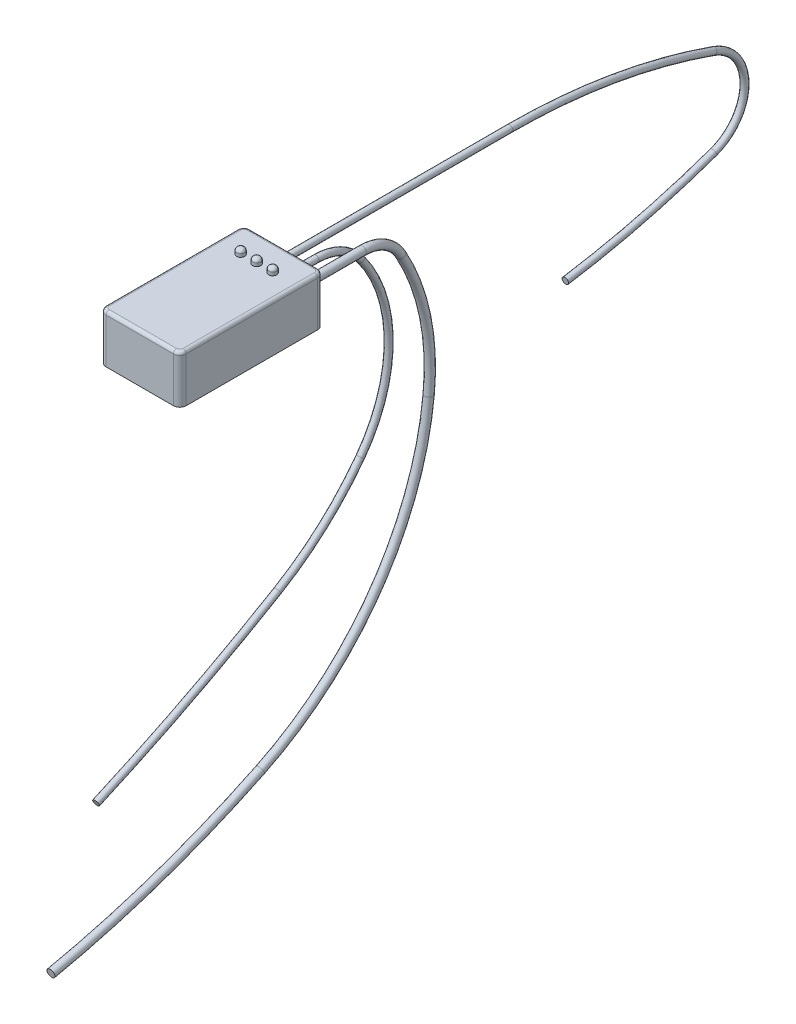
ISO-10303-21;
HEADER;
FILE_DESCRIPTION(('STEP AP214'),'2;1');
FILE_NAME('part.step','',(''),(''),'','','');
FILE_SCHEMA(('AUTOMOTIVE_DESIGN { 1 0 10303 214 1 1 1 1 }'));
ENDSEC;
DATA;
#1=APPLICATION_CONTEXT('core data for automotive mechanical design processes');
#2=APPLICATION_PROTOCOL_DEFINITION('international standard','automotive_design',2000,#1);
#3=PRODUCT_CONTEXT('',#1,'mechanical');
#4=PRODUCT('Part','Part','',(#3));
#5=PRODUCT_RELATED_PRODUCT_CATEGORY('part','',(#4));
#6=PRODUCT_DEFINITION_FORMATION('','',#4);
#7=PRODUCT_DEFINITION_CONTEXT('part definition',#1,'design');
#8=PRODUCT_DEFINITION('design','',#6,#7);
#9=PRODUCT_DEFINITION_SHAPE('','',#8);
#10=(LENGTH_UNIT() NAMED_UNIT(*) SI_UNIT(.MILLI.,.METRE.));
#11=(NAMED_UNIT(*) PLANE_ANGLE_UNIT() SI_UNIT($,.RADIAN.));
#12=(NAMED_UNIT(*) SI_UNIT($,.STERADIAN.) SOLID_ANGLE_UNIT());
#13=UNCERTAINTY_MEASURE_WITH_UNIT(LENGTH_MEASURE(1.E-05),#10,'distance_accuracy_value','');
#14=(GEOMETRIC_REPRESENTATION_CONTEXT(3) GLOBAL_UNCERTAINTY_ASSIGNED_CONTEXT((#13)) GLOBAL_UNIT_ASSIGNED_CONTEXT((#10,
#11,#12)) REPRESENTATION_CONTEXT('',''));
#15=CARTESIAN_POINT('',(0.,0.,0.));
#16=DIRECTION('',(0.,0.,1.));
#17=DIRECTION('',(1.,0.,0.));
#18=AXIS2_PLACEMENT_3D('',#15,#16,#17);
#19=CARTESIAN_POINT('',(10.,277.10516450602,228.03735027729));
#20=DIRECTION('',(-1.,0.,0.));
#21=DIRECTION('',(0.,0.,1.));
#22=AXIS2_PLACEMENT_3D('',#19,#20,#21);
#23=TOROIDAL_SURFACE('',#22,569.119683702392,2.5);
#24=CARTESIAN_POINT('',(10.,-234.987444743006,-20.2736924293021));
#25=DIRECTION('',(0.,-0.436307247521666,0.899797747141027));
#26=DIRECTION('',(-1.,0.,0.));
#27=AXIS2_PLACEMENT_3D('',#24,#25,#26);
#28=CIRCLE('',#27,2.5);
#29=CARTESIAN_POINT('',(10.,-237.236939110858,-21.3644605481063));
#30=VERTEX_POINT('',#29);
#31=EDGE_CURVE('E50',#30,#30,#28,.T.);
#32=CARTESIAN_POINT('',(10.,-279.727978420525,110.419046786479));
#33=DIRECTION('',(0.,-0.206667080508705,0.97841132343918));
#34=DIRECTION('',(-1.,0.,0.));
#35=AXIS2_PLACEMENT_3D('',#32,#33,#34);
#36=CIRCLE('',#35,2.5);
#37=CARTESIAN_POINT('',(10.,-282.174006729123,109.902379085207));
#38=VERTEX_POINT('',#37);
#39=EDGE_CURVE('E11',#38,#38,#36,.T.);
#40=CARTESIAN_POINT('',(10.,277.10516450602,228.03735027729));
#41=DIRECTION('',(-1.,0.,0.));
#42=DIRECTION('',(0.,0.,1.));
#43=AXIS2_PLACEMENT_3D('',#40,#41,#42);
#44=CIRCLE('',#43,571.619683702392);
#45=EDGE_CURVE('',#30,#38,#44,.T.);
#46=ORIENTED_EDGE('',*,*,#31,.T.);
#47=ORIENTED_EDGE('',*,*,#39,.F.);
#48=ORIENTED_EDGE('',*,*,#45,.T.);
#49=ORIENTED_EDGE('',*,*,#45,.F.);
#50=EDGE_LOOP('',(#46,#48,#47,#49));
#51=FACE_BOUND('',#50,.T.);
#52=ADVANCED_FACE('F44',(#51),#23,.T.);
#53=CARTESIAN_POINT('',(10.,-65.6304696890282,61.8466239075371));
#54=DIRECTION('',(-1.,0.,0.));
#55=DIRECTION('',(0.,0.,1.));
#56=AXIS2_PLACEMENT_3D('',#53,#54,#55);
#57=TOROIDAL_SURFACE('',#56,188.216713802723,2.5);
#58=CARTESIAN_POINT('',(10.,-84.5104083685493,-125.4207765394));
#59=DIRECTION('',(0.,-0.994956274941765,0.100309575584822));
#60=DIRECTION('',(-1.,0.,0.));
#61=AXIS2_PLACEMENT_3D('',#58,#59,#60);
#62=CIRCLE('',#61,2.5);
#63=CARTESIAN_POINT('',(10.,-84.7611823075114,-127.908167226755));
#64=VERTEX_POINT('',#63);
#65=EDGE_CURVE('E54',#64,#64,#62,.T.);
#66=CARTESIAN_POINT('',(10.,-65.6304696890282,61.8466239075371));
#67=DIRECTION('',(-1.,0.,0.));
#68=DIRECTION('',(0.,0.,1.));
#69=AXIS2_PLACEMENT_3D('',#66,#67,#68);
#70=CIRCLE('',#69,190.716713802723);
#71=EDGE_CURVE('',#64,#30,#70,.T.);
#72=ORIENTED_EDGE('',*,*,#65,.T.);
#73=ORIENTED_EDGE('',*,*,#31,.F.);
#74=ORIENTED_EDGE('',*,*,#71,.T.);
#75=ORIENTED_EDGE('',*,*,#71,.F.);
#76=EDGE_LOOP('',(#72,#74,#73,#75));
#77=FACE_BOUND('',#76,.T.);
#78=ADVANCED_FACE('F88',(#77),#57,.T.);
#79=CARTESIAN_POINT('',(10.,-70.1123783380911,17.3912156566061));
#80=DIRECTION('',(-1.,0.,0.));
#81=DIRECTION('',(0.,0.,1.));
#82=AXIS2_PLACEMENT_3D('',#79,#80,#81);
#83=TOROIDAL_SURFACE('',#82,143.535948053964,2.5);
#84=CARTESIAN_POINT('',(10.,0.,-107.855831364578));
#85=DIRECTION('',(0.,-0.872583131398524,-0.488465637275281));
#86=DIRECTION('',(-1.,0.,0.));
#87=AXIS2_PLACEMENT_3D('',#84,#85,#86);
#88=CIRCLE('',#87,2.5);
#89=CARTESIAN_POINT('',(10.,1.22116409318819,-110.037289193074));
#90=VERTEX_POINT('',#89);
#91=EDGE_CURVE('E58',#90,#90,#88,.T.);
#92=CARTESIAN_POINT('',(10.,-70.1123783380911,17.3912156566061));
#93=DIRECTION('',(-1.,0.,0.));
#94=DIRECTION('',(0.,0.,1.));
#95=AXIS2_PLACEMENT_3D('',#92,#93,#94);
#96=CIRCLE('',#95,146.035948053964);
#97=EDGE_CURVE('',#90,#64,#96,.T.);
#98=ORIENTED_EDGE('',*,*,#91,.T.);
#99=ORIENTED_EDGE('',*,*,#65,.F.);
#100=ORIENTED_EDGE('',*,*,#97,.T.);
#101=ORIENTED_EDGE('',*,*,#97,.F.);
#102=EDGE_LOOP('',(#98,#100,#99,#101));
#103=FACE_BOUND('',#102,.T.);
#104=ADVANCED_FACE('F92',(#103),#83,.T.);
#105=CARTESIAN_POINT('',(10.,-13.368640349845,-83.9744174659898));
#106=DIRECTION('',(-1.,0.,0.));
#107=DIRECTION('',(0.,0.,1.));
#108=AXIS2_PLACEMENT_3D('',#105,#106,#107);
#109=TOROIDAL_SURFACE('',#108,27.368640349845,2.5);
#110=CARTESIAN_POINT('',(10.,14.,-83.9744174659898));
#111=DIRECTION('',(0.,0.,-1.));
#112=DIRECTION('',(-1.,0.,0.));
#113=AXIS2_PLACEMENT_3D('',#110,#111,#112);
#114=CIRCLE('',#113,2.5);
#115=CARTESIAN_POINT('',(10.,16.5,-83.9744174659898));
#116=VERTEX_POINT('',#115);
#117=EDGE_CURVE('E63',#116,#116,#114,.T.);
#118=CARTESIAN_POINT('',(10.,-13.368640349845,-83.9744174659898));
#119=DIRECTION('',(-1.,0.,0.));
#120=DIRECTION('',(0.,0.,1.));
#121=AXIS2_PLACEMENT_3D('',#118,#119,#120);
#122=CIRCLE('',#121,29.868640349845);
#123=EDGE_CURVE('',#116,#90,#122,.T.);
#124=ORIENTED_EDGE('',*,*,#117,.T.);
#125=ORIENTED_EDGE('',*,*,#91,.F.);
#126=ORIENTED_EDGE('',*,*,#123,.T.);
#127=ORIENTED_EDGE('',*,*,#123,.F.);
#128=EDGE_LOOP('',(#124,#126,#125,#127));
#129=FACE_BOUND('',#128,.T.);
#130=ADVANCED_FACE('F70',(#129),#109,.T.);
#131=CARTESIAN_POINT('',(10.,14.,-83.9744174659898));
#132=DIRECTION('',(0.,0.,1.));
#133=DIRECTION('',(0.,-1.,0.));
#134=AXIS2_PLACEMENT_3D('',#131,#132,#133);
#135=CYLINDRICAL_SURFACE('',#134,2.5);
#136=ORIENTED_EDGE('',*,*,#117,.F.);
#137=EDGE_LOOP('',(#136));
#138=FACE_BOUND('',#137,.T.);
#139=CARTESIAN_POINT('',(10.,14.,-41.));
#140=DIRECTION('',(0.,0.,-1.));
#141=DIRECTION('',(-1.,0.,0.));
#142=AXIS2_PLACEMENT_3D('',#139,#140,#141);
#143=CIRCLE('',#142,2.5);
#144=CARTESIAN_POINT('',(7.5,14.,-41.));
#145=VERTEX_POINT('',#144);
#146=EDGE_CURVE('E64',#145,#145,#143,.T.);
#147=ORIENTED_EDGE('',*,*,#146,.T.);
#148=EDGE_LOOP('',(#147));
#149=FACE_BOUND('',#148,.T.);
#150=ADVANCED_FACE('F73',(#138,#149),#135,.T.);
#151=CARTESIAN_POINT('',(10.,-279.727978420525,110.419046786479));
#152=DIRECTION('',(0.,-0.206667080508705,0.97841132343918));
#153=DIRECTION('',(-1.,0.,0.));
#154=AXIS2_PLACEMENT_3D('',#151,#152,#153);
#155=PLANE('',#154);
#156=ORIENTED_EDGE('',*,*,#39,.T.);
#157=EDGE_LOOP('',(#156));
#158=FACE_BOUND('',#157,.T.);
#159=ADVANCED_FACE('F76',(#158),#155,.T.);
#160=CARTESIAN_POINT('',(10.,14.,-41.));
#161=DIRECTION('',(0.,0.,-1.));
#162=DIRECTION('',(-1.,0.,0.));
#163=AXIS2_PLACEMENT_3D('',#160,#161,#162);
#164=PLANE('',#163);
#165=ORIENTED_EDGE('',*,*,#146,.F.);
#166=EDGE_LOOP('',(#165));
#167=FACE_BOUND('',#166,.T.);
#168=ADVANCED_FACE('F80',(#167),#164,.F.);
#169=CLOSED_SHELL('',(#52,#78,#104,#130,#150,#159,#168));
#170=MANIFOLD_SOLID_BREP('B2',#169);
#171=CARTESIAN_POINT('',(0.,746.95104154458,492.305029356148));
#172=DIRECTION('',(-1.,0.,0.));
#173=DIRECTION('',(0.,0.,1.));
#174=AXIS2_PLACEMENT_3D('',#171,#172,#173);
#175=TOROIDAL_SURFACE('',#174,1046.59381629685,2.);
#176=CARTESIAN_POINT('',(0.,-153.573451167439,-41.0000000000001));
#177=DIRECTION('',(0.,-0.509562564819212,0.860433607278834));
#178=DIRECTION('',(-1.,0.,0.));
#179=AXIS2_PLACEMENT_3D('',#176,#177,#178);
#180=CIRCLE('',#179,2.);
#181=CARTESIAN_POINT('',(0.,-155.294318381997,-42.0191251296385));
#182=VERTEX_POINT('',#181);
#183=EDGE_CURVE('E159',#182,#182,#180,.T.);
#184=CARTESIAN_POINT('',(0.,-211.656753955002,72.2696609426853));
#185=DIRECTION('',(0.,-0.401335610695342,0.915931071417384));
#186=DIRECTION('',(-1.,0.,0.));
#187=AXIS2_PLACEMENT_3D('',#184,#185,#186);
#188=CIRCLE('',#187,2.);
#189=CARTESIAN_POINT('',(0.,-213.488616097837,71.4669897212945));
#190=VERTEX_POINT('',#189);
#191=EDGE_CURVE('E43',#190,#190,#188,.T.);
#192=CARTESIAN_POINT('',(0.,746.95104154458,492.305029356148));
#193=DIRECTION('',(-1.,0.,0.));
#194=DIRECTION('',(0.,0.,1.));
#195=AXIS2_PLACEMENT_3D('',#192,#193,#194);
#196=CIRCLE('',#195,1048.59381629685);
#197=EDGE_CURVE('',#182,#190,#196,.T.);
#198=ORIENTED_EDGE('',*,*,#183,.T.);
#199=ORIENTED_EDGE('',*,*,#191,.F.);
#200=ORIENTED_EDGE('',*,*,#197,.T.);
#201=ORIENTED_EDGE('',*,*,#197,.F.);
#202=EDGE_LOOP('',(#198,#200,#199,#201));
#203=FACE_BOUND('',#202,.T.);
#204=ADVANCED_FACE('F153',(#203),#175,.T.);
#205=CARTESIAN_POINT('',(0.,-1.7794884782628,48.8948161690093));
#206=DIRECTION('',(-1.,0.,0.));
#207=DIRECTION('',(0.,0.,1.));
#208=AXIS2_PLACEMENT_3D('',#205,#206,#207);
#209=TOROIDAL_SURFACE('',#208,176.415659970829,2.);
#210=CARTESIAN_POINT('',(0.,-106.900434751906,-92.7811229931397));
#211=DIRECTION('',(0.,-0.803080288822296,0.595870833071311));
#212=DIRECTION('',(-1.,0.,0.));
#213=AXIS2_PLACEMENT_3D('',#210,#211,#212);
#214=CIRCLE('',#213,2.);
#215=CARTESIAN_POINT('',(0.,-108.092176418048,-94.3872835707843));
#216=VERTEX_POINT('',#215);
#217=EDGE_CURVE('E163',#216,#216,#214,.T.);
#218=CARTESIAN_POINT('',(0.,-1.7794884782628,48.8948161690093));
#219=DIRECTION('',(-1.,0.,0.));
#220=DIRECTION('',(0.,0.,1.));
#221=AXIS2_PLACEMENT_3D('',#218,#219,#220);
#222=CIRCLE('',#221,178.415659970829);
#223=EDGE_CURVE('',#216,#182,#222,.T.);
#224=ORIENTED_EDGE('',*,*,#217,.T.);
#225=ORIENTED_EDGE('',*,*,#183,.F.);
#226=ORIENTED_EDGE('',*,*,#223,.T.);
#227=ORIENTED_EDGE('',*,*,#223,.F.);
#228=EDGE_LOOP('',(#224,#226,#225,#227));
#229=FACE_BOUND('',#228,.T.);
#230=ADVANCED_FACE('F197',(#229),#209,.T.);
#231=CARTESIAN_POINT('',(0.,-53.4502173759529,-20.744007521912));
#232=DIRECTION('',(-1.,0.,0.));
#233=DIRECTION('',(0.,0.,1.));
#234=AXIS2_PLACEMENT_3D('',#231,#232,#233);
#235=TOROIDAL_SURFACE('',#234,89.7010130542103,2.);
#236=CARTESIAN_POINT('',(0.,0.,-92.7811229931397));
#237=DIRECTION('',(0.,-0.803080288822295,-0.595870833071312));
#238=DIRECTION('',(-1.,0.,0.));
#239=AXIS2_PLACEMENT_3D('',#236,#237,#238);
#240=CIRCLE('',#239,2.);
#241=CARTESIAN_POINT('',(0.,1.19174166614262,-94.3872835707843));
#242=VERTEX_POINT('',#241);
#243=EDGE_CURVE('E167',#242,#242,#240,.T.);
#244=CARTESIAN_POINT('',(0.,-53.4502173759529,-20.744007521912));
#245=DIRECTION('',(-1.,0.,0.));
#246=DIRECTION('',(0.,0.,1.));
#247=AXIS2_PLACEMENT_3D('',#244,#245,#246);
#248=CIRCLE('',#247,91.7010130542103);
#249=EDGE_CURVE('',#242,#216,#248,.T.);
#250=ORIENTED_EDGE('',*,*,#243,.T.);
#251=ORIENTED_EDGE('',*,*,#217,.F.);
#252=ORIENTED_EDGE('',*,*,#249,.T.);
#253=ORIENTED_EDGE('',*,*,#249,.F.);
#254=EDGE_LOOP('',(#250,#252,#251,#253));
#255=FACE_BOUND('',#254,.T.);
#256=ADVANCED_FACE('F201',(#255),#235,.T.);
#257=CARTESIAN_POINT('',(0.,-20.6423894775959,-64.9605028459775));
#258=DIRECTION('',(-1.,0.,0.));
#259=DIRECTION('',(0.,0.,1.));
#260=AXIS2_PLACEMENT_3D('',#257,#258,#259);
#261=TOROIDAL_SURFACE('',#260,34.6423894775959,2.);
#262=CARTESIAN_POINT('',(0.,14.,-64.9605028459775));
#263=DIRECTION('',(0.,0.,-1.));
#264=DIRECTION('',(-1.,0.,0.));
#265=AXIS2_PLACEMENT_3D('',#262,#263,#264);
#266=CIRCLE('',#265,2.);
#267=CARTESIAN_POINT('',(0.,16.,-64.9605028459775));
#268=VERTEX_POINT('',#267);
#269=EDGE_CURVE('E172',#268,#268,#266,.T.);
#270=CARTESIAN_POINT('',(0.,-20.6423894775959,-64.9605028459775));
#271=DIRECTION('',(-1.,0.,0.));
#272=DIRECTION('',(0.,0.,1.));
#273=AXIS2_PLACEMENT_3D('',#270,#271,#272);
#274=CIRCLE('',#273,36.6423894775959);
#275=EDGE_CURVE('',#268,#242,#274,.T.);
#276=ORIENTED_EDGE('',*,*,#269,.T.);
#277=ORIENTED_EDGE('',*,*,#243,.F.);
#278=ORIENTED_EDGE('',*,*,#275,.T.);
#279=ORIENTED_EDGE('',*,*,#275,.F.);
#280=EDGE_LOOP('',(#276,#278,#277,#279));
#281=FACE_BOUND('',#280,.T.);
#282=ADVANCED_FACE('F179',(#281),#261,.T.);
#283=CARTESIAN_POINT('',(0.,14.,-64.9605028459775));
#284=DIRECTION('',(0.,0.,1.));
#285=DIRECTION('',(0.,-1.,0.));
#286=AXIS2_PLACEMENT_3D('',#283,#284,#285);
#287=CYLINDRICAL_SURFACE('',#286,2.);
#288=ORIENTED_EDGE('',*,*,#269,.F.);
#289=EDGE_LOOP('',(#288));
#290=FACE_BOUND('',#289,.T.);
#291=CARTESIAN_POINT('',(0.,14.,-41.));
#292=DIRECTION('',(0.,0.,-1.));
#293=DIRECTION('',(-1.,0.,0.));
#294=AXIS2_PLACEMENT_3D('',#291,#292,#293);
#295=CIRCLE('',#294,2.);
#296=CARTESIAN_POINT('',(-2.,14.,-41.));
#297=VERTEX_POINT('',#296);
#298=EDGE_CURVE('E173',#297,#297,#295,.T.);
#299=ORIENTED_EDGE('',*,*,#298,.T.);
#300=EDGE_LOOP('',(#299));
#301=FACE_BOUND('',#300,.T.);
#302=ADVANCED_FACE('F182',(#290,#301),#287,.T.);
#303=CARTESIAN_POINT('',(0.,-211.656753955002,72.2696609426853));
#304=DIRECTION('',(0.,-0.401335610695342,0.915931071417384));
#305=DIRECTION('',(-1.,0.,0.));
#306=AXIS2_PLACEMENT_3D('',#303,#304,#305);
#307=PLANE('',#306);
#308=ORIENTED_EDGE('',*,*,#191,.T.);
#309=EDGE_LOOP('',(#308));
#310=FACE_BOUND('',#309,.T.);
#311=ADVANCED_FACE('F185',(#310),#307,.T.);
#312=CARTESIAN_POINT('',(0.,14.,-41.));
#313=DIRECTION('',(0.,0.,-1.));
#314=DIRECTION('',(-1.,0.,0.));
#315=AXIS2_PLACEMENT_3D('',#312,#313,#314);
#316=PLANE('',#315);
#317=ORIENTED_EDGE('',*,*,#298,.F.);
#318=EDGE_LOOP('',(#317));
#319=FACE_BOUND('',#318,.T.);
#320=ADVANCED_FACE('F189',(#319),#316,.F.);
#321=CLOSED_SHELL('',(#204,#230,#256,#282,#302,#311,#320));
#322=MANIFOLD_SOLID_BREP('B6',#321);
#323=CARTESIAN_POINT('',(-10.,425.314344756156,-151.160472883657));
#324=DIRECTION('',(-1.,0.,0.));
#325=DIRECTION('',(0.,0.,1.));
#326=AXIS2_PLACEMENT_3D('',#323,#324,#325);
#327=TOROIDAL_SURFACE('',#326,517.294417473573,2.);
#328=CARTESIAN_POINT('',(-10.,-62.4995777723773,-323.297311871274));
#329=DIRECTION('',(0.,-0.3327637669632,0.943010220197247));
#330=DIRECTION('',(-1.,0.,0.));
#331=AXIS2_PLACEMENT_3D('',#328,#329,#330);
#332=CIRCLE('',#331,2.);
#333=CARTESIAN_POINT('',(-10.,-64.3855982127717,-323.962839405201));
#334=VERTEX_POINT('',#333);
#335=EDGE_CURVE('E270',#334,#334,#332,.T.);
#336=CARTESIAN_POINT('',(-10.,-85.8194212672105,-230.758133528259));
#337=DIRECTION('',(0.,-0.153873032369594,0.988090628388604));
#338=DIRECTION('',(-1.,0.,0.));
#339=AXIS2_PLACEMENT_3D('',#336,#337,#338);
#340=CIRCLE('',#339,2.);
#341=CARTESIAN_POINT('',(-10.,-87.7956025239876,-231.065879592999));
#342=VERTEX_POINT('',#341);
#343=EDGE_CURVE('E152',#342,#342,#340,.T.);
#344=CARTESIAN_POINT('',(-10.,425.314344756156,-151.160472883657));
#345=DIRECTION('',(-1.,0.,0.));
#346=DIRECTION('',(0.,0.,1.));
#347=AXIS2_PLACEMENT_3D('',#344,#345,#346);
#348=CIRCLE('',#347,519.294417473573);
#349=EDGE_CURVE('',#334,#342,#348,.T.);
#350=ORIENTED_EDGE('',*,*,#335,.T.);
#351=ORIENTED_EDGE('',*,*,#343,.F.);
#352=ORIENTED_EDGE('',*,*,#349,.T.);
#353=ORIENTED_EDGE('',*,*,#349,.F.);
#354=EDGE_LOOP('',(#350,#352,#351,#353));
#355=FACE_BOUND('',#354,.T.);
#356=ADVANCED_FACE('F264',(#355),#327,.T.);
#357=CARTESIAN_POINT('',(-10.,-35.1540219229831,-313.647776819312));
#358=DIRECTION('',(-1.,0.,0.));
#359=DIRECTION('',(0.,0.,1.));
#360=AXIS2_PLACEMENT_3D('',#357,#358,#359);
#361=TOROIDAL_SURFACE('',#360,28.9981542762877,2.);
#362=CARTESIAN_POINT('',(-10.,-7.80846607358896,-323.297311871274));
#363=DIRECTION('',(0.,-0.332763766963516,-0.943010220197136));
#364=DIRECTION('',(-1.,0.,0.));
#365=AXIS2_PLACEMENT_3D('',#362,#363,#364);
#366=CIRCLE('',#365,2.);
#367=CARTESIAN_POINT('',(-10.,-5.92244563319458,-323.962839405201));
#368=VERTEX_POINT('',#367);
#369=EDGE_CURVE('E274',#368,#368,#366,.T.);
#370=CARTESIAN_POINT('',(-10.,-35.1540219229831,-313.647776819312));
#371=DIRECTION('',(-1.,0.,0.));
#372=DIRECTION('',(0.,0.,1.));
#373=AXIS2_PLACEMENT_3D('',#370,#371,#372);
#374=CIRCLE('',#373,30.9981542762877);
#375=EDGE_CURVE('',#368,#334,#374,.T.);
#376=ORIENTED_EDGE('',*,*,#369,.T.);
#377=ORIENTED_EDGE('',*,*,#335,.F.);
#378=ORIENTED_EDGE('',*,*,#375,.T.);
#379=ORIENTED_EDGE('',*,*,#375,.F.);
#380=EDGE_LOOP('',(#376,#378,#377,#379));
#381=FACE_BOUND('',#380,.T.);
#382=ADVANCED_FACE('F305',(#381),#361,.T.);
#383=CARTESIAN_POINT('',(-10.,-368.673281929279,-195.957509060196));
#384=DIRECTION('',(-1.,0.,0.));
#385=DIRECTION('',(0.,0.,1.));
#386=AXIS2_PLACEMENT_3D('',#383,#384,#385);
#387=TOROIDAL_SURFACE('',#386,382.673281929279,2.);
#388=CARTESIAN_POINT('',(-10.,14.,-195.957509060196));
#389=DIRECTION('',(0.,0.,-1.));
#390=DIRECTION('',(-1.,0.,0.));
#391=AXIS2_PLACEMENT_3D('',#388,#389,#390);
#392=CIRCLE('',#391,2.);
#393=CARTESIAN_POINT('',(-10.,16.,-195.957509060196));
#394=VERTEX_POINT('',#393);
#395=EDGE_CURVE('E278',#394,#394,#392,.T.);
#396=CARTESIAN_POINT('',(-10.,-368.673281929279,-195.957509060196));
#397=DIRECTION('',(-1.,0.,0.));
#398=DIRECTION('',(0.,0.,1.));
#399=AXIS2_PLACEMENT_3D('',#396,#397,#398);
#400=CIRCLE('',#399,384.673281929279);
#401=EDGE_CURVE('',#394,#368,#400,.T.);
#402=ORIENTED_EDGE('',*,*,#395,.T.);
#403=ORIENTED_EDGE('',*,*,#369,.F.);
#404=ORIENTED_EDGE('',*,*,#401,.T.);
#405=ORIENTED_EDGE('',*,*,#401,.F.);
#406=EDGE_LOOP('',(#402,#404,#403,#405));
#407=FACE_BOUND('',#406,.T.);
#408=ADVANCED_FACE('F287',(#407),#387,.T.);
#409=CARTESIAN_POINT('',(-10.,14.,-195.957509060196));
#410=DIRECTION('',(0.,0.,1.));
#411=DIRECTION('',(0.,-1.,0.));
#412=AXIS2_PLACEMENT_3D('',#409,#410,#411);
#413=CYLINDRICAL_SURFACE('',#412,2.);
#414=ORIENTED_EDGE('',*,*,#395,.F.);
#415=EDGE_LOOP('',(#414));
#416=FACE_BOUND('',#415,.T.);
#417=CARTESIAN_POINT('',(-10.,14.,-41.));
#418=DIRECTION('',(0.,0.,-1.));
#419=DIRECTION('',(-1.,0.,0.));
#420=AXIS2_PLACEMENT_3D('',#417,#418,#419);
#421=CIRCLE('',#420,2.);
#422=CARTESIAN_POINT('',(-12.,14.,-41.));
#423=VERTEX_POINT('',#422);
#424=EDGE_CURVE('E281',#423,#423,#421,.T.);
#425=ORIENTED_EDGE('',*,*,#424,.T.);
#426=EDGE_LOOP('',(#425));
#427=FACE_BOUND('',#426,.T.);
#428=ADVANCED_FACE('F290',(#416,#427),#413,.T.);
#429=CARTESIAN_POINT('',(-10.,-85.8194212672105,-230.758133528259));
#430=DIRECTION('',(0.,-0.153873032369594,0.988090628388604));
#431=DIRECTION('',(-1.,0.,0.));
#432=AXIS2_PLACEMENT_3D('',#429,#430,#431);
#433=PLANE('',#432);
#434=ORIENTED_EDGE('',*,*,#343,.T.);
#435=EDGE_LOOP('',(#434));
#436=FACE_BOUND('',#435,.T.);
#437=ADVANCED_FACE('F293',(#436),#433,.T.);
#438=CARTESIAN_POINT('',(-10.,14.,-41.));
#439=DIRECTION('',(0.,0.,-1.));
#440=DIRECTION('',(-1.,0.,0.));
#441=AXIS2_PLACEMENT_3D('',#438,#439,#440);
#442=PLANE('',#441);
#443=ORIENTED_EDGE('',*,*,#424,.F.);
#444=EDGE_LOOP('',(#443));
#445=FACE_BOUND('',#444,.T.);
#446=ADVANCED_FACE('F297',(#445),#442,.F.);
#447=CLOSED_SHELL('',(#356,#382,#408,#428,#437,#446));
#448=MANIFOLD_SOLID_BREP('B38',#447);
#449=CARTESIAN_POINT('',(-10.,32.,-28.));
#450=DIRECTION('',(0.,-1.,0.));
#451=DIRECTION('',(0.,0.,-1.));
#452=AXIS2_PLACEMENT_3D('',#449,#450,#451);
#453=CYLINDRICAL_SURFACE('',#452,2.5);
#454=CARTESIAN_POINT('',(-10.,32.,-28.));
#455=DIRECTION('',(0.,1.,0.));
#456=DIRECTION('',(0.,0.,1.));
#457=AXIS2_PLACEMENT_3D('',#454,#455,#456);
#458=CIRCLE('',#457,2.5);
#459=CARTESIAN_POINT('',(-10.,32.,-25.5));
#460=VERTEX_POINT('',#459);
#461=EDGE_CURVE('E262',#460,#460,#458,.T.);
#462=ORIENTED_EDGE('',*,*,#461,.F.);
#463=EDGE_LOOP('',(#462));
#464=FACE_BOUND('',#463,.T.);
#465=CARTESIAN_POINT('',(-10.,30.,-28.));
#466=DIRECTION('',(0.,1.,0.));
#467=DIRECTION('',(0.,0.,1.));
#468=AXIS2_PLACEMENT_3D('',#465,#466,#467);
#469=CIRCLE('',#468,2.5);
#470=CARTESIAN_POINT('',(-10.,30.,-25.5));
#471=VERTEX_POINT('',#470);
#472=EDGE_CURVE('E367',#471,#471,#469,.T.);
#473=ORIENTED_EDGE('',*,*,#472,.T.);
#474=EDGE_LOOP('',(#473));
#475=FACE_BOUND('',#474,.T.);
#476=ADVANCED_FACE('F359',(#464,#475),#453,.T.);
#477=CARTESIAN_POINT('',(-10.,32.,-28.));
#478=DIRECTION('',(1.,0.,0.));
#479=DIRECTION('',(0.,0.,1.));
#480=AXIS2_PLACEMENT_3D('',#477,#478,#479);
#481=ELLIPSE('',#480,2.5,2.);
#482=TRIMMED_CURVE('',#481,(PARAMETER_VALUE(4.71238898038469)),
(PARAMETER_VALUE(7.85398163397448)),.T.,.PARAMETER.);
#483=CARTESIAN_POINT('',(-10.,30.,-28.));
#484=DIRECTION('',(0.,1.,0.));
#485=AXIS1_PLACEMENT('',#483,#484);
#486=SURFACE_OF_REVOLUTION('',#482,#485);
#487=CARTESIAN_POINT('',(-10.,34.,-28.));
#488=VERTEX_POINT('',#487);
#489=VERTEX_LOOP('',#488);
#490=FACE_BOUND('',#489,.T.);
#491=ORIENTED_EDGE('',*,*,#461,.T.);
#492=EDGE_LOOP('',(#491));
#493=FACE_BOUND('',#492,.T.);
#494=ADVANCED_FACE('F361',(#490,#493),#486,.F.);
#495=CARTESIAN_POINT('',(-10.,30.,-28.));
#496=DIRECTION('',(0.,1.,0.));
#497=DIRECTION('',(0.,0.,1.));
#498=AXIS2_PLACEMENT_3D('',#495,#496,#497);
#499=PLANE('',#498);
#500=ORIENTED_EDGE('',*,*,#472,.F.);
#501=EDGE_LOOP('',(#500));
#502=FACE_BOUND('',#501,.T.);
#503=ADVANCED_FACE('F372',(#502),#499,.F.);
#504=CLOSED_SHELL('',(#476,#494,#503));
#505=MANIFOLD_SOLID_BREP('B147',#504);
#506=CARTESIAN_POINT('',(9.99999999999999,32.,-28.));
#507=DIRECTION('',(0.,-1.,0.));
#508=DIRECTION('',(0.,0.,-1.));
#509=AXIS2_PLACEMENT_3D('',#506,#507,#508);
#510=CYLINDRICAL_SURFACE('',#509,2.5);
#511=CARTESIAN_POINT('',(9.99999999999999,32.,-28.));
#512=DIRECTION('',(0.,1.,0.));
#513=DIRECTION('',(0.,0.,1.));
#514=AXIS2_PLACEMENT_3D('',#511,#512,#513);
#515=CIRCLE('',#514,2.5);
#516=CARTESIAN_POINT('',(9.99999999999999,32.,-25.5));
#517=VERTEX_POINT('',#516);
#518=EDGE_CURVE('E357',#517,#517,#515,.T.);
#519=ORIENTED_EDGE('',*,*,#518,.F.);
#520=EDGE_LOOP('',(#519));
#521=FACE_BOUND('',#520,.T.);
#522=CARTESIAN_POINT('',(9.99999999999999,30.,-28.));
#523=DIRECTION('',(0.,1.,0.));
#524=DIRECTION('',(0.,0.,1.));
#525=AXIS2_PLACEMENT_3D('',#522,#523,#524);
#526=CIRCLE('',#525,2.5);
#527=CARTESIAN_POINT('',(9.99999999999999,30.,-25.5));
#528=VERTEX_POINT('',#527);
#529=EDGE_CURVE('E421',#528,#528,#526,.T.);
#530=ORIENTED_EDGE('',*,*,#529,.T.);
#531=EDGE_LOOP('',(#530));
#532=FACE_BOUND('',#531,.T.);
#533=ADVANCED_FACE('F413',(#521,#532),#510,.T.);
#534=CARTESIAN_POINT('',(9.99999999999999,32.,-28.));
#535=DIRECTION('',(1.,0.,0.));
#536=DIRECTION('',(0.,0.,1.));
#537=AXIS2_PLACEMENT_3D('',#534,#535,#536);
#538=ELLIPSE('',#537,2.5,2.);
#539=TRIMMED_CURVE('',#538,(PARAMETER_VALUE(4.71238898038469)),
(PARAMETER_VALUE(7.85398163397448)),.T.,.PARAMETER.);
#540=CARTESIAN_POINT('',(9.99999999999999,30.,-28.));
#541=DIRECTION('',(0.,1.,0.));
#542=AXIS1_PLACEMENT('',#540,#541);
#543=SURFACE_OF_REVOLUTION('',#539,#542);
#544=CARTESIAN_POINT('',(9.99999999999999,34.,-28.));
#545=VERTEX_POINT('',#544);
#546=VERTEX_LOOP('',#545);
#547=FACE_BOUND('',#546,.T.);
#548=ORIENTED_EDGE('',*,*,#518,.T.);
#549=EDGE_LOOP('',(#548));
#550=FACE_BOUND('',#549,.T.);
#551=ADVANCED_FACE('F415',(#547,#550),#543,.F.);
#552=CARTESIAN_POINT('',(9.99999999999999,30.,-28.));
#553=DIRECTION('',(0.,1.,0.));
#554=DIRECTION('',(0.,0.,1.));
#555=AXIS2_PLACEMENT_3D('',#552,#553,#554);
#556=PLANE('',#555);
#557=ORIENTED_EDGE('',*,*,#529,.F.);
#558=EDGE_LOOP('',(#557));
#559=FACE_BOUND('',#558,.T.);
#560=ADVANCED_FACE('F426',(#559),#556,.F.);
#561=CLOSED_SHELL('',(#533,#551,#560));
#562=MANIFOLD_SOLID_BREP('B256',#561);
#563=CARTESIAN_POINT('',(0.,32.,-28.));
#564=DIRECTION('',(0.,-1.,0.));
#565=DIRECTION('',(0.,0.,-1.));
#566=AXIS2_PLACEMENT_3D('',#563,#564,#565);
#567=CYLINDRICAL_SURFACE('',#566,2.5);
#568=CARTESIAN_POINT('',(0.,32.,-28.));
#569=DIRECTION('',(0.,1.,0.));
#570=DIRECTION('',(0.,0.,1.));
#571=AXIS2_PLACEMENT_3D('',#568,#569,#570);
#572=CIRCLE('',#571,2.5);
#573=CARTESIAN_POINT('',(0.,32.,-25.5));
#574=VERTEX_POINT('',#573);
#575=EDGE_CURVE('E411',#574,#574,#572,.T.);
#576=ORIENTED_EDGE('',*,*,#575,.F.);
#577=EDGE_LOOP('',(#576));
#578=FACE_BOUND('',#577,.T.);
#579=CARTESIAN_POINT('',(0.,30.,-28.));
#580=DIRECTION('',(0.,1.,0.));
#581=DIRECTION('',(0.,0.,1.));
#582=AXIS2_PLACEMENT_3D('',#579,#580,#581);
#583=CIRCLE('',#582,2.5);
#584=CARTESIAN_POINT('',(0.,30.,-25.5));
#585=VERTEX_POINT('',#584);
#586=EDGE_CURVE('E474',#585,#585,#583,.T.);
#587=ORIENTED_EDGE('',*,*,#586,.T.);
#588=EDGE_LOOP('',(#587));
#589=FACE_BOUND('',#588,.T.);
#590=ADVANCED_FACE('F466',(#578,#589),#567,.T.);
#591=CARTESIAN_POINT('',(0.,32.,-28.));
#592=DIRECTION('',(1.,0.,0.));
#593=DIRECTION('',(0.,0.,1.));
#594=AXIS2_PLACEMENT_3D('',#591,#592,#593);
#595=ELLIPSE('',#594,2.5,2.);
#596=TRIMMED_CURVE('',#595,(PARAMETER_VALUE(4.71238898038469)),
(PARAMETER_VALUE(7.85398163397448)),.T.,.PARAMETER.);
#597=CARTESIAN_POINT('',(0.,30.,-28.));
#598=DIRECTION('',(0.,1.,0.));
#599=AXIS1_PLACEMENT('',#597,#598);
#600=SURFACE_OF_REVOLUTION('',#596,#599);
#601=CARTESIAN_POINT('',(0.,34.,-28.));
#602=VERTEX_POINT('',#601);
#603=VERTEX_LOOP('',#602);
#604=FACE_BOUND('',#603,.T.);
#605=ORIENTED_EDGE('',*,*,#575,.T.);
#606=EDGE_LOOP('',(#605));
#607=FACE_BOUND('',#606,.T.);
#608=ADVANCED_FACE('F468',(#604,#607),#600,.F.);
#609=CARTESIAN_POINT('',(0.,30.,-28.));
#610=DIRECTION('',(0.,1.,0.));
#611=DIRECTION('',(0.,0.,1.));
#612=AXIS2_PLACEMENT_3D('',#609,#610,#611);
#613=PLANE('',#612);
#614=ORIENTED_EDGE('',*,*,#586,.F.);
#615=EDGE_LOOP('',(#614));
#616=FACE_BOUND('',#615,.T.);
#617=ADVANCED_FACE('F479',(#616),#613,.F.);
#618=CLOSED_SHELL('',(#590,#608,#617));
#619=MANIFOLD_SOLID_BREP('B351',#618);
#620=CARTESIAN_POINT('',(-25.,30.,45.));
#621=DIRECTION('',(1.,0.,0.));
#622=DIRECTION('',(0.,0.,-1.));
#623=AXIS2_PLACEMENT_3D('',#620,#621,#622);
#624=PLANE('',#623);
#625=DIRECTION('',(0.,-1.,0.));
#626=VECTOR('',#625,1.);
#627=CARTESIAN_POINT('',(-25.,30.,41.));
#628=LINE('',#627,#626);
#629=CARTESIAN_POINT('',(-25.,0.,41.));
#630=VERTEX_POINT('',#629);
#631=CARTESIAN_POINT('',(-25.,28.,41.));
#632=VERTEX_POINT('',#631);
#633=EDGE_CURVE('E611',#630,#632,#628,.F.);
#634=ORIENTED_EDGE('',*,*,#633,.T.);
#635=DIRECTION('',(0.,0.,1.));
#636=VECTOR('',#635,1.);
#637=CARTESIAN_POINT('',(-25.,28.,-41.));
#638=LINE('',#637,#636);
#639=CARTESIAN_POINT('',(-25.,28.,-41.));
#640=VERTEX_POINT('',#639);
#641=EDGE_CURVE('E464',#632,#640,#638,.F.);
#642=ORIENTED_EDGE('',*,*,#641,.T.);
#643=DIRECTION('',(0.,-1.,0.));
#644=VECTOR('',#643,1.);
#645=CARTESIAN_POINT('',(-25.,30.,-41.));
#646=LINE('',#645,#644);
#647=CARTESIAN_POINT('',(-25.,0.,-41.));
#648=VERTEX_POINT('',#647);
#649=EDGE_CURVE('E615',#640,#648,#646,.T.);
#650=ORIENTED_EDGE('',*,*,#649,.T.);
#651=DIRECTION('',(0.,0.,1.));
#652=VECTOR('',#651,1.);
#653=CARTESIAN_POINT('',(-25.,0.,45.));
#654=LINE('',#653,#652);
#655=EDGE_CURVE('E622',#648,#630,#654,.T.);
#656=ORIENTED_EDGE('',*,*,#655,.T.);
#657=EDGE_LOOP('',(#634,#642,#650,#656));
#658=FACE_BOUND('',#657,.T.);
#659=ADVANCED_FACE('F510',(#658),#624,.F.);
#660=CARTESIAN_POINT('',(25.,30.,45.));
#661=DIRECTION('',(0.,0.,-1.));
#662=DIRECTION('',(-1.,0.,0.));
#663=AXIS2_PLACEMENT_3D('',#660,#661,#662);
#664=PLANE('',#663);
#665=DIRECTION('',(0.,-1.,0.));
#666=VECTOR('',#665,1.);
#667=CARTESIAN_POINT('',(21.,30.,45.));
#668=LINE('',#667,#666);
#669=CARTESIAN_POINT('',(21.,0.,45.));
#670=VERTEX_POINT('',#669);
#671=CARTESIAN_POINT('',(21.,28.,45.));
#672=VERTEX_POINT('',#671);
#673=EDGE_CURVE('E607',#670,#672,#668,.F.);
#674=ORIENTED_EDGE('',*,*,#673,.T.);
#675=DIRECTION('',(1.,0.,0.));
#676=VECTOR('',#675,1.);
#677=CARTESIAN_POINT('',(-21.,28.,45.));
#678=LINE('',#677,#676);
#679=CARTESIAN_POINT('',(-21.,28.,45.));
#680=VERTEX_POINT('',#679);
#681=EDGE_CURVE('E534',#672,#680,#678,.F.);
#682=ORIENTED_EDGE('',*,*,#681,.T.);
#683=DIRECTION('',(0.,-1.,0.));
#684=VECTOR('',#683,1.);
#685=CARTESIAN_POINT('',(-21.,30.,45.));
#686=LINE('',#685,#684);
#687=CARTESIAN_POINT('',(-21.,0.,45.));
#688=VERTEX_POINT('',#687);
#689=EDGE_CURVE('E599',#680,#688,#686,.T.);
#690=ORIENTED_EDGE('',*,*,#689,.T.);
#691=DIRECTION('',(1.,0.,0.));
#692=VECTOR('',#691,1.);
#693=CARTESIAN_POINT('',(25.,0.,45.));
#694=LINE('',#693,#692);
#695=EDGE_CURVE('E603',#688,#670,#694,.T.);
#696=ORIENTED_EDGE('',*,*,#695,.T.);
#697=EDGE_LOOP('',(#674,#682,#690,#696));
#698=FACE_BOUND('',#697,.T.);
#699=ADVANCED_FACE('F601',(#698),#664,.F.);
#700=CARTESIAN_POINT('',(25.,30.,45.));
#701=DIRECTION('',(-1.,0.,0.));
#702=DIRECTION('',(0.,0.,1.));
#703=AXIS2_PLACEMENT_3D('',#700,#701,#702);
#704=PLANE('',#703);
#705=DIRECTION('',(0.,-1.,0.));
#706=VECTOR('',#705,1.);
#707=CARTESIAN_POINT('',(25.,30.,-41.));
#708=LINE('',#707,#706);
#709=CARTESIAN_POINT('',(25.,0.,-41.));
#710=VERTEX_POINT('',#709);
#711=CARTESIAN_POINT('',(25.,28.,-41.));
#712=VERTEX_POINT('',#711);
#713=EDGE_CURVE('E638',#710,#712,#708,.F.);
#714=ORIENTED_EDGE('',*,*,#713,.T.);
#715=DIRECTION('',(0.,0.,-1.));
#716=VECTOR('',#715,1.);
#717=CARTESIAN_POINT('',(25.,28.,41.));
#718=LINE('',#717,#716);
#719=CARTESIAN_POINT('',(25.,28.,41.));
#720=VERTEX_POINT('',#719);
#721=EDGE_CURVE('E672',#712,#720,#718,.F.);
#722=ORIENTED_EDGE('',*,*,#721,.T.);
#723=DIRECTION('',(0.,-1.,0.));
#724=VECTOR('',#723,1.);
#725=CARTESIAN_POINT('',(25.,30.,41.));
#726=LINE('',#725,#724);
#727=CARTESIAN_POINT('',(25.,0.,41.));
#728=VERTEX_POINT('',#727);
#729=EDGE_CURVE('E641',#720,#728,#726,.T.);
#730=ORIENTED_EDGE('',*,*,#729,.T.);
#731=DIRECTION('',(0.,0.,-1.));
#732=VECTOR('',#731,1.);
#733=CARTESIAN_POINT('',(25.,0.,45.));
#734=LINE('',#733,#732);
#735=EDGE_CURVE('E621',#728,#710,#734,.T.);
#736=ORIENTED_EDGE('',*,*,#735,.T.);
#737=EDGE_LOOP('',(#714,#722,#730,#736));
#738=FACE_BOUND('',#737,.T.);
#739=ADVANCED_FACE('F712',(#738),#704,.F.);
#740=CARTESIAN_POINT('',(25.,30.,-45.));
#741=DIRECTION('',(0.,0.,1.));
#742=DIRECTION('',(1.,0.,0.));
#743=AXIS2_PLACEMENT_3D('',#740,#741,#742);
#744=PLANE('',#743);
#745=DIRECTION('',(0.,-1.,0.));
#746=VECTOR('',#745,1.);
#747=CARTESIAN_POINT('',(-21.,30.,-45.));
#748=LINE('',#747,#746);
#749=CARTESIAN_POINT('',(-21.,0.,-45.));
#750=VERTEX_POINT('',#749);
#751=CARTESIAN_POINT('',(-21.,28.,-45.));
#752=VERTEX_POINT('',#751);
#753=EDGE_CURVE('E645',#750,#752,#748,.F.);
#754=ORIENTED_EDGE('',*,*,#753,.T.);
#755=DIRECTION('',(-1.,0.,0.));
#756=VECTOR('',#755,1.);
#757=CARTESIAN_POINT('',(21.,28.,-45.));
#758=LINE('',#757,#756);
#759=CARTESIAN_POINT('',(21.,28.,-45.));
#760=VERTEX_POINT('',#759);
#761=EDGE_CURVE('E668',#752,#760,#758,.F.);
#762=ORIENTED_EDGE('',*,*,#761,.T.);
#763=DIRECTION('',(0.,-1.,0.));
#764=VECTOR('',#763,1.);
#765=CARTESIAN_POINT('',(21.,30.,-45.));
#766=LINE('',#765,#764);
#767=CARTESIAN_POINT('',(21.,0.,-45.));
#768=VERTEX_POINT('',#767);
#769=EDGE_CURVE('E643',#760,#768,#766,.T.);
#770=ORIENTED_EDGE('',*,*,#769,.T.);
#771=DIRECTION('',(-1.,0.,0.));
#772=VECTOR('',#771,1.);
#773=CARTESIAN_POINT('',(25.,0.,-45.));
#774=LINE('',#773,#772);
#775=EDGE_CURVE('E625',#768,#750,#774,.T.);
#776=ORIENTED_EDGE('',*,*,#775,.T.);
#777=EDGE_LOOP('',(#754,#762,#770,#776));
#778=FACE_BOUND('',#777,.T.);
#779=ADVANCED_FACE('F867',(#778),#744,.F.);
#780=CARTESIAN_POINT('',(-25.,30.,-45.));
#781=DIRECTION('',(0.,1.,0.));
#782=DIRECTION('',(0.,0.,1.));
#783=AXIS2_PLACEMENT_3D('',#780,#781,#782);
#784=PLANE('',#783);
#785=DIRECTION('',(-1.,0.,0.));
#786=VECTOR('',#785,1.);
#787=CARTESIAN_POINT('',(-21.,30.,-43.));
#788=LINE('',#787,#786);
#789=CARTESIAN_POINT('',(21.,30.,-43.));
#790=VERTEX_POINT('',#789);
#791=CARTESIAN_POINT('',(-21.,30.,-43.));
#792=VERTEX_POINT('',#791);
#793=EDGE_CURVE('E660',#790,#792,#788,.T.);
#794=ORIENTED_EDGE('',*,*,#793,.T.);
#795=CARTESIAN_POINT('',(-21.,30.,-41.));
#796=DIRECTION('',(0.,1.,0.));
#797=DIRECTION('',(0.,0.,1.));
#798=AXIS2_PLACEMENT_3D('',#795,#796,#797);
#799=CIRCLE('',#798,2.);
#800=CARTESIAN_POINT('',(-23.,30.,-41.));
#801=VERTEX_POINT('',#800);
#802=EDGE_CURVE('E662',#792,#801,#799,.T.);
#803=ORIENTED_EDGE('',*,*,#802,.T.);
#804=DIRECTION('',(0.,0.,1.));
#805=VECTOR('',#804,1.);
#806=CARTESIAN_POINT('',(-23.,30.,41.));
#807=LINE('',#806,#805);
#808=CARTESIAN_POINT('',(-23.,30.,41.));
#809=VERTEX_POINT('',#808);
#810=EDGE_CURVE('E648',#801,#809,#807,.T.);
#811=ORIENTED_EDGE('',*,*,#810,.T.);
#812=CARTESIAN_POINT('',(-21.,30.,41.));
#813=DIRECTION('',(0.,1.,0.));
#814=DIRECTION('',(0.,0.,1.));
#815=AXIS2_PLACEMENT_3D('',#812,#813,#814);
#816=CIRCLE('',#815,2.);
#817=CARTESIAN_POINT('',(-21.,30.,43.));
#818=VERTEX_POINT('',#817);
#819=EDGE_CURVE('E650',#809,#818,#816,.T.);
#820=ORIENTED_EDGE('',*,*,#819,.T.);
#821=DIRECTION('',(1.,0.,0.));
#822=VECTOR('',#821,1.);
#823=CARTESIAN_POINT('',(21.,30.,43.));
#824=LINE('',#823,#822);
#825=CARTESIAN_POINT('',(21.,30.,43.));
#826=VERTEX_POINT('',#825);
#827=EDGE_CURVE('E652',#818,#826,#824,.T.);
#828=ORIENTED_EDGE('',*,*,#827,.T.);
#829=CARTESIAN_POINT('',(21.,30.,41.));
#830=DIRECTION('',(0.,1.,0.));
#831=DIRECTION('',(0.,0.,1.));
#832=AXIS2_PLACEMENT_3D('',#829,#830,#831);
#833=CIRCLE('',#832,2.);
#834=CARTESIAN_POINT('',(23.,30.,41.));
#835=VERTEX_POINT('',#834);
#836=EDGE_CURVE('E654',#826,#835,#833,.T.);
#837=ORIENTED_EDGE('',*,*,#836,.T.);
#838=DIRECTION('',(0.,0.,-1.));
#839=VECTOR('',#838,1.);
#840=CARTESIAN_POINT('',(23.,30.,-41.));
#841=LINE('',#840,#839);
#842=CARTESIAN_POINT('',(23.,30.,-41.));
#843=VERTEX_POINT('',#842);
#844=EDGE_CURVE('E656',#835,#843,#841,.T.);
#845=ORIENTED_EDGE('',*,*,#844,.T.);
#846=CARTESIAN_POINT('',(21.,30.,-41.));
#847=DIRECTION('',(0.,1.,0.));
#848=DIRECTION('',(0.,0.,1.));
#849=AXIS2_PLACEMENT_3D('',#846,#847,#848);
#850=CIRCLE('',#849,2.);
#851=EDGE_CURVE('E658',#843,#790,#850,.T.);
#852=ORIENTED_EDGE('',*,*,#851,.T.);
#853=EDGE_LOOP('',(#794,#803,#811,#820,#828,#837,#845,#852));
#854=FACE_BOUND('',#853,.T.);
#855=ADVANCED_FACE('F731',(#854),#784,.T.);
#856=CARTESIAN_POINT('',(-25.,0.,-45.));
#857=DIRECTION('',(0.,1.,0.));
#858=DIRECTION('',(0.,0.,1.));
#859=AXIS2_PLACEMENT_3D('',#856,#857,#858);
#860=PLANE('',#859);
#861=ORIENTED_EDGE('',*,*,#695,.F.);
#862=CARTESIAN_POINT('',(-21.,0.,41.));
#863=DIRECTION('',(0.,1.,0.));
#864=DIRECTION('',(0.,0.,1.));
#865=AXIS2_PLACEMENT_3D('',#862,#863,#864);
#866=CIRCLE('',#865,4.);
#867=EDGE_CURVE('E609',#688,#630,#866,.F.);
#868=ORIENTED_EDGE('',*,*,#867,.T.);
#869=ORIENTED_EDGE('',*,*,#655,.F.);
#870=CARTESIAN_POINT('',(-21.,0.,-41.));
#871=DIRECTION('',(0.,1.,0.));
#872=DIRECTION('',(0.,0.,1.));
#873=AXIS2_PLACEMENT_3D('',#870,#871,#872);
#874=CIRCLE('',#873,4.);
#875=EDGE_CURVE('E633',#648,#750,#874,.F.);
#876=ORIENTED_EDGE('',*,*,#875,.T.);
#877=ORIENTED_EDGE('',*,*,#775,.F.);
#878=CARTESIAN_POINT('',(21.,0.,-41.));
#879=DIRECTION('',(0.,1.,0.));
#880=DIRECTION('',(0.,0.,1.));
#881=AXIS2_PLACEMENT_3D('',#878,#879,#880);
#882=CIRCLE('',#881,4.);
#883=EDGE_CURVE('E606',#768,#710,#882,.F.);
#884=ORIENTED_EDGE('',*,*,#883,.T.);
#885=ORIENTED_EDGE('',*,*,#735,.F.);
#886=CARTESIAN_POINT('',(21.,0.,41.));
#887=DIRECTION('',(0.,1.,0.));
#888=DIRECTION('',(0.,0.,1.));
#889=AXIS2_PLACEMENT_3D('',#886,#887,#888);
#890=CIRCLE('',#889,4.);
#891=EDGE_CURVE('E616',#728,#670,#890,.F.);
#892=ORIENTED_EDGE('',*,*,#891,.T.);
#893=EDGE_LOOP('',(#861,#868,#869,#876,#877,#884,#885,#892));
#894=FACE_BOUND('',#893,.T.);
#895=ADVANCED_FACE('F618',(#894),#860,.F.);
#896=CARTESIAN_POINT('',(-21.,30.,41.));
#897=DIRECTION('',(0.,-1.,0.));
#898=DIRECTION('',(0.,0.,-1.));
#899=AXIS2_PLACEMENT_3D('',#896,#897,#898);
#900=CYLINDRICAL_SURFACE('',#899,4.);
#901=ORIENTED_EDGE('',*,*,#689,.F.);
#902=CARTESIAN_POINT('',(-21.,28.,41.));
#903=DIRECTION('',(0.,1.,0.));
#904=DIRECTION('',(0.,0.,1.));
#905=AXIS2_PLACEMENT_3D('',#902,#903,#904);
#906=CIRCLE('',#905,4.);
#907=EDGE_CURVE('E519',#680,#632,#906,.F.);
#908=ORIENTED_EDGE('',*,*,#907,.T.);
#909=ORIENTED_EDGE('',*,*,#633,.F.);
#910=ORIENTED_EDGE('',*,*,#867,.F.);
#911=EDGE_LOOP('',(#901,#908,#909,#910));
#912=FACE_BOUND('',#911,.T.);
#913=ADVANCED_FACE('F610',(#912),#900,.T.);
#914=CARTESIAN_POINT('',(21.,30.,41.));
#915=DIRECTION('',(0.,-1.,0.));
#916=DIRECTION('',(0.,0.,-1.));
#917=AXIS2_PLACEMENT_3D('',#914,#915,#916);
#918=CYLINDRICAL_SURFACE('',#917,4.);
#919=ORIENTED_EDGE('',*,*,#729,.F.);
#920=CARTESIAN_POINT('',(21.,28.,41.));
#921=DIRECTION('',(0.,1.,0.));
#922=DIRECTION('',(0.,0.,1.));
#923=AXIS2_PLACEMENT_3D('',#920,#921,#922);
#924=CIRCLE('',#923,4.);
#925=EDGE_CURVE('E674',#720,#672,#924,.F.);
#926=ORIENTED_EDGE('',*,*,#925,.T.);
#927=ORIENTED_EDGE('',*,*,#673,.F.);
#928=ORIENTED_EDGE('',*,*,#891,.F.);
#929=EDGE_LOOP('',(#919,#926,#927,#928));
#930=FACE_BOUND('',#929,.T.);
#931=ADVANCED_FACE('F710',(#930),#918,.T.);
#932=CARTESIAN_POINT('',(-21.,30.,-41.));
#933=DIRECTION('',(0.,-1.,0.));
#934=DIRECTION('',(0.,0.,-1.));
#935=AXIS2_PLACEMENT_3D('',#932,#933,#934);
#936=CYLINDRICAL_SURFACE('',#935,4.);
#937=ORIENTED_EDGE('',*,*,#649,.F.);
#938=CARTESIAN_POINT('',(-21.,28.,-41.));
#939=DIRECTION('',(0.,1.,0.));
#940=DIRECTION('',(0.,0.,1.));
#941=AXIS2_PLACEMENT_3D('',#938,#939,#940);
#942=CIRCLE('',#941,4.);
#943=EDGE_CURVE('E665',#640,#752,#942,.F.);
#944=ORIENTED_EDGE('',*,*,#943,.T.);
#945=ORIENTED_EDGE('',*,*,#753,.F.);
#946=ORIENTED_EDGE('',*,*,#875,.F.);
#947=EDGE_LOOP('',(#937,#944,#945,#946));
#948=FACE_BOUND('',#947,.T.);
#949=ADVANCED_FACE('F747',(#948),#936,.T.);
#950=CARTESIAN_POINT('',(21.,30.,-41.));
#951=DIRECTION('',(0.,-1.,0.));
#952=DIRECTION('',(0.,0.,-1.));
#953=AXIS2_PLACEMENT_3D('',#950,#951,#952);
#954=CYLINDRICAL_SURFACE('',#953,4.);
#955=ORIENTED_EDGE('',*,*,#769,.F.);
#956=CARTESIAN_POINT('',(21.,28.,-41.));
#957=DIRECTION('',(0.,1.,0.));
#958=DIRECTION('',(0.,0.,1.));
#959=AXIS2_PLACEMENT_3D('',#956,#957,#958);
#960=CIRCLE('',#959,4.);
#961=EDGE_CURVE('E670',#760,#712,#960,.F.);
#962=ORIENTED_EDGE('',*,*,#961,.T.);
#963=ORIENTED_EDGE('',*,*,#713,.F.);
#964=ORIENTED_EDGE('',*,*,#883,.F.);
#965=EDGE_LOOP('',(#955,#962,#963,#964));
#966=FACE_BOUND('',#965,.T.);
#967=ADVANCED_FACE('F717',(#966),#954,.T.);
#968=CARTESIAN_POINT('',(21.,28.,41.));
#969=DIRECTION('',(0.,1.,0.));
#970=DIRECTION('',(0.,0.,1.));
#971=AXIS2_PLACEMENT_3D('',#968,#969,#970);
#972=DEGENERATE_TOROIDAL_SURFACE('',#971,2.,2.,.T.);
#973=CARTESIAN_POINT('',(21.,28.,43.));
#974=DIRECTION('',(-1.,0.,0.));
#975=DIRECTION('',(0.,0.,1.));
#976=AXIS2_PLACEMENT_3D('',#973,#974,#975);
#977=CIRCLE('',#976,2.);
#978=EDGE_CURVE('E693',#672,#826,#977,.T.);
#979=ORIENTED_EDGE('',*,*,#978,.F.);
#980=ORIENTED_EDGE('',*,*,#925,.F.);
#981=CARTESIAN_POINT('',(23.,28.,41.));
#982=DIRECTION('',(0.,0.,-1.));
#983=DIRECTION('',(-1.,0.,0.));
#984=AXIS2_PLACEMENT_3D('',#981,#982,#983);
#985=CIRCLE('',#984,2.);
#986=EDGE_CURVE('E514',#835,#720,#985,.T.);
#987=ORIENTED_EDGE('',*,*,#986,.F.);
#988=ORIENTED_EDGE('',*,*,#836,.F.);
#989=EDGE_LOOP('',(#979,#980,#987,#988));
#990=FACE_BOUND('',#989,.T.);
#991=ADVANCED_FACE('F512',(#990),#972,.T.);
#992=CARTESIAN_POINT('',(23.,28.,-45.));
#993=DIRECTION('',(0.,0.,1.));
#994=DIRECTION('',(1.,0.,0.));
#995=AXIS2_PLACEMENT_3D('',#992,#993,#994);
#996=CYLINDRICAL_SURFACE('',#995,2.);
#997=ORIENTED_EDGE('',*,*,#986,.T.);
#998=ORIENTED_EDGE('',*,*,#721,.F.);
#999=CARTESIAN_POINT('',(23.,28.,-41.));
#1000=DIRECTION('',(0.,0.,-1.));
#1001=DIRECTION('',(-1.,0.,0.));
#1002=AXIS2_PLACEMENT_3D('',#999,#1000,#1001);
#1003=CIRCLE('',#1002,2.);
#1004=EDGE_CURVE('E691',#843,#712,#1003,.T.);
#1005=ORIENTED_EDGE('',*,*,#1004,.F.);
#1006=ORIENTED_EDGE('',*,*,#844,.F.);
#1007=EDGE_LOOP('',(#997,#998,#1005,#1006));
#1008=FACE_BOUND('',#1007,.T.);
#1009=ADVANCED_FACE('F703',(#1008),#996,.T.);
#1010=CARTESIAN_POINT('',(-25.,28.,43.));
#1011=DIRECTION('',(-1.,0.,0.));
#1012=DIRECTION('',(0.,0.,1.));
#1013=AXIS2_PLACEMENT_3D('',#1010,#1011,#1012);
#1014=CYLINDRICAL_SURFACE('',#1013,2.);
#1015=ORIENTED_EDGE('',*,*,#978,.T.);
#1016=ORIENTED_EDGE('',*,*,#827,.F.);
#1017=CARTESIAN_POINT('',(-21.,28.,43.));
#1018=DIRECTION('',(-1.,0.,0.));
#1019=DIRECTION('',(0.,0.,1.));
#1020=AXIS2_PLACEMENT_3D('',#1017,#1018,#1019);
#1021=CIRCLE('',#1020,2.);
#1022=EDGE_CURVE('E688',#680,#818,#1021,.T.);
#1023=ORIENTED_EDGE('',*,*,#1022,.F.);
#1024=ORIENTED_EDGE('',*,*,#681,.F.);
#1025=EDGE_LOOP('',(#1015,#1016,#1023,#1024));
#1026=FACE_BOUND('',#1025,.T.);
#1027=ADVANCED_FACE('F733',(#1026),#1014,.T.);
#1028=CARTESIAN_POINT('',(21.,28.,-41.));
#1029=DIRECTION('',(0.,1.,0.));
#1030=DIRECTION('',(0.,0.,1.));
#1031=AXIS2_PLACEMENT_3D('',#1028,#1029,#1030);
#1032=DEGENERATE_TOROIDAL_SURFACE('',#1031,2.,2.,.T.);
#1033=ORIENTED_EDGE('',*,*,#1004,.T.);
#1034=ORIENTED_EDGE('',*,*,#961,.F.);
#1035=CARTESIAN_POINT('',(21.,28.,-43.));
#1036=DIRECTION('',(-1.,0.,0.));
#1037=DIRECTION('',(0.,0.,1.));
#1038=AXIS2_PLACEMENT_3D('',#1035,#1036,#1037);
#1039=CIRCLE('',#1038,2.);
#1040=EDGE_CURVE('E685',#790,#760,#1039,.T.);
#1041=ORIENTED_EDGE('',*,*,#1040,.F.);
#1042=ORIENTED_EDGE('',*,*,#851,.F.);
#1043=EDGE_LOOP('',(#1033,#1034,#1041,#1042));
#1044=FACE_BOUND('',#1043,.T.);
#1045=ADVANCED_FACE('F722',(#1044),#1032,.T.);
#1046=CARTESIAN_POINT('',(-21.,28.,41.));
#1047=DIRECTION('',(0.,1.,0.));
#1048=DIRECTION('',(0.,0.,1.));
#1049=AXIS2_PLACEMENT_3D('',#1046,#1047,#1048);
#1050=DEGENERATE_TOROIDAL_SURFACE('',#1049,2.,2.,.T.);
#1051=ORIENTED_EDGE('',*,*,#1022,.T.);
#1052=ORIENTED_EDGE('',*,*,#819,.F.);
#1053=CARTESIAN_POINT('',(-23.,28.,41.));
#1054=DIRECTION('',(0.,0.,-1.));
#1055=DIRECTION('',(-1.,0.,0.));
#1056=AXIS2_PLACEMENT_3D('',#1053,#1054,#1055);
#1057=CIRCLE('',#1056,2.);
#1058=EDGE_CURVE('E682',#632,#809,#1057,.T.);
#1059=ORIENTED_EDGE('',*,*,#1058,.F.);
#1060=ORIENTED_EDGE('',*,*,#907,.F.);
#1061=EDGE_LOOP('',(#1051,#1052,#1059,#1060));
#1062=FACE_BOUND('',#1061,.T.);
#1063=ADVANCED_FACE('F735',(#1062),#1050,.T.);
#1064=CARTESIAN_POINT('',(-25.,28.,-43.));
#1065=DIRECTION('',(1.,0.,0.));
#1066=DIRECTION('',(0.,0.,-1.));
#1067=AXIS2_PLACEMENT_3D('',#1064,#1065,#1066);
#1068=CYLINDRICAL_SURFACE('',#1067,2.);
#1069=ORIENTED_EDGE('',*,*,#1040,.T.);
#1070=ORIENTED_EDGE('',*,*,#761,.F.);
#1071=CARTESIAN_POINT('',(-21.,28.,-43.));
#1072=DIRECTION('',(-1.,0.,0.));
#1073=DIRECTION('',(0.,0.,1.));
#1074=AXIS2_PLACEMENT_3D('',#1071,#1072,#1073);
#1075=CIRCLE('',#1074,2.);
#1076=EDGE_CURVE('E680',#792,#752,#1075,.T.);
#1077=ORIENTED_EDGE('',*,*,#1076,.F.);
#1078=ORIENTED_EDGE('',*,*,#793,.F.);
#1079=EDGE_LOOP('',(#1069,#1070,#1077,#1078));
#1080=FACE_BOUND('',#1079,.T.);
#1081=ADVANCED_FACE('F727',(#1080),#1068,.T.);
#1082=CARTESIAN_POINT('',(-23.,28.,-45.));
#1083=DIRECTION('',(0.,0.,-1.));
#1084=DIRECTION('',(-1.,0.,0.));
#1085=AXIS2_PLACEMENT_3D('',#1082,#1083,#1084);
#1086=CYLINDRICAL_SURFACE('',#1085,2.);
#1087=ORIENTED_EDGE('',*,*,#1058,.T.);
#1088=ORIENTED_EDGE('',*,*,#810,.F.);
#1089=CARTESIAN_POINT('',(-23.,28.,-41.));
#1090=DIRECTION('',(0.,0.,-1.));
#1091=DIRECTION('',(-1.,0.,0.));
#1092=AXIS2_PLACEMENT_3D('',#1089,#1090,#1091);
#1093=CIRCLE('',#1092,2.);
#1094=EDGE_CURVE('E678',#640,#801,#1093,.T.);
#1095=ORIENTED_EDGE('',*,*,#1094,.F.);
#1096=ORIENTED_EDGE('',*,*,#641,.F.);
#1097=EDGE_LOOP('',(#1087,#1088,#1095,#1096));
#1098=FACE_BOUND('',#1097,.T.);
#1099=ADVANCED_FACE('F741',(#1098),#1086,.T.);
#1100=CARTESIAN_POINT('',(-21.,28.,-41.));
#1101=DIRECTION('',(0.,1.,0.));
#1102=DIRECTION('',(0.,0.,1.));
#1103=AXIS2_PLACEMENT_3D('',#1100,#1101,#1102);
#1104=DEGENERATE_TOROIDAL_SURFACE('',#1103,2.,2.,.T.);
#1105=ORIENTED_EDGE('',*,*,#1076,.T.);
#1106=ORIENTED_EDGE('',*,*,#943,.F.);
#1107=ORIENTED_EDGE('',*,*,#1094,.T.);
#1108=ORIENTED_EDGE('',*,*,#802,.F.);
#1109=EDGE_LOOP('',(#1105,#1106,#1107,#1108));
#1110=FACE_BOUND('',#1109,.T.);
#1111=ADVANCED_FACE('F750',(#1110),#1104,.T.);
#1112=CLOSED_SHELL('',(#659,#699,#739,#779,#855,#895,#913,#931,#949,#967,#991,#1009,#1027,#1045,
#1063,#1081,#1099,#1111));
#1113=MANIFOLD_SOLID_BREP('B405',#1112);
#1114=ADVANCED_BREP_SHAPE_REPRESENTATION('',(#18,#170,#322,#448,#505,#562,#619,#1113),#14);
#1115=SHAPE_DEFINITION_REPRESENTATION(#9,#1114);
ENDSEC;
END-ISO-10303-21;
